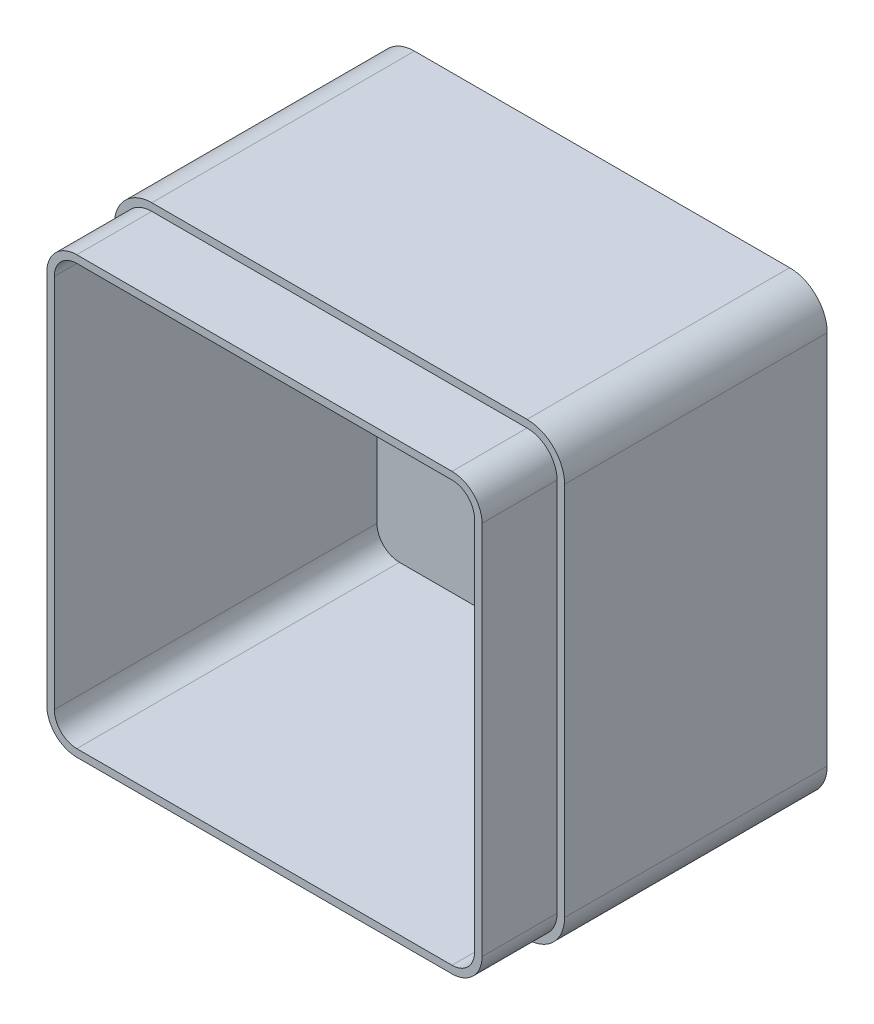
ISO-10303-21;
HEADER;
FILE_DESCRIPTION(('STEP AP214'),'2;1');
FILE_NAME('part.step','',(''),(''),'','','');
FILE_SCHEMA(('AUTOMOTIVE_DESIGN { 1 0 10303 214 1 1 1 1 }'));
ENDSEC;
DATA;
#1=APPLICATION_CONTEXT('core data for automotive mechanical design processes');
#2=APPLICATION_PROTOCOL_DEFINITION('international standard','automotive_design',2000,#1);
#3=PRODUCT_CONTEXT('',#1,'mechanical');
#4=PRODUCT('Part','Part','',(#3));
#5=PRODUCT_RELATED_PRODUCT_CATEGORY('part','',(#4));
#6=PRODUCT_DEFINITION_FORMATION('','',#4);
#7=PRODUCT_DEFINITION_CONTEXT('part definition',#1,'design');
#8=PRODUCT_DEFINITION('design','',#6,#7);
#9=PRODUCT_DEFINITION_SHAPE('','',#8);
#10=(LENGTH_UNIT() NAMED_UNIT(*) SI_UNIT(.MILLI.,.METRE.));
#11=(NAMED_UNIT(*) PLANE_ANGLE_UNIT() SI_UNIT($,.RADIAN.));
#12=(NAMED_UNIT(*) SI_UNIT($,.STERADIAN.) SOLID_ANGLE_UNIT());
#13=UNCERTAINTY_MEASURE_WITH_UNIT(LENGTH_MEASURE(1.E-05),#10,'distance_accuracy_value','');
#14=(GEOMETRIC_REPRESENTATION_CONTEXT(3) GLOBAL_UNCERTAINTY_ASSIGNED_CONTEXT((#13)) GLOBAL_UNIT_ASSIGNED_CONTEXT((#10,
#11,#12)) REPRESENTATION_CONTEXT('',''));
#15=CARTESIAN_POINT('',(0.,0.,0.));
#16=DIRECTION('',(0.,0.,1.));
#17=DIRECTION('',(1.,0.,0.));
#18=AXIS2_PLACEMENT_3D('',#15,#16,#17);
#19=CARTESIAN_POINT('',(0.,0.,90.));
#20=DIRECTION('',(0.,0.,-1.));
#21=DIRECTION('',(-1.,0.,0.));
#22=AXIS2_PLACEMENT_3D('',#19,#20,#21);
#23=PLANE('',#22);
#24=DIRECTION('',(1.,0.,0.));
#25=VECTOR('',#24,1.);
#26=CARTESIAN_POINT('',(0.,4.,90.));
#27=LINE('',#26,#25);
#28=CARTESIAN_POINT('',(9.99999999999999,4.,90.));
#29=VERTEX_POINT('',#28);
#30=CARTESIAN_POINT('',(110.,4.,90.));
#31=VERTEX_POINT('',#30);
#32=EDGE_CURVE('E384',#29,#31,#27,.T.);
#33=ORIENTED_EDGE('',*,*,#32,.F.);
#34=CARTESIAN_POINT('',(10.,10.,90.));
#35=DIRECTION('',(0.,0.,-1.));
#36=DIRECTION('',(-1.,0.,0.));
#37=AXIS2_PLACEMENT_3D('',#34,#35,#36);
#38=CIRCLE('',#37,6.);
#39=CARTESIAN_POINT('',(4.,9.99999999999999,90.));
#40=VERTEX_POINT('',#39);
#41=EDGE_CURVE('E385',#40,#29,#38,.F.);
#42=ORIENTED_EDGE('',*,*,#41,.F.);
#43=DIRECTION('',(0.,-1.,0.));
#44=VECTOR('',#43,1.);
#45=CARTESIAN_POINT('',(4.,0.,90.));
#46=LINE('',#45,#44);
#47=CARTESIAN_POINT('',(4.,110.,90.));
#48=VERTEX_POINT('',#47);
#49=EDGE_CURVE('E357',#48,#40,#46,.T.);
#50=ORIENTED_EDGE('',*,*,#49,.F.);
#51=CARTESIAN_POINT('',(10.,110.,90.));
#52=DIRECTION('',(0.,0.,-1.));
#53=DIRECTION('',(-1.,0.,0.));
#54=AXIS2_PLACEMENT_3D('',#51,#52,#53);
#55=CIRCLE('',#54,6.);
#56=CARTESIAN_POINT('',(9.99999999999999,116.,90.));
#57=VERTEX_POINT('',#56);
#58=EDGE_CURVE('E388',#57,#48,#55,.F.);
#59=ORIENTED_EDGE('',*,*,#58,.F.);
#60=DIRECTION('',(-1.,0.,0.));
#61=VECTOR('',#60,1.);
#62=CARTESIAN_POINT('',(0.,116.,90.));
#63=LINE('',#62,#61);
#64=CARTESIAN_POINT('',(110.,116.,90.));
#65=VERTEX_POINT('',#64);
#66=EDGE_CURVE('E374',#65,#57,#63,.T.);
#67=ORIENTED_EDGE('',*,*,#66,.F.);
#68=CARTESIAN_POINT('',(110.,110.,90.));
#69=DIRECTION('',(0.,0.,-1.));
#70=DIRECTION('',(-1.,0.,0.));
#71=AXIS2_PLACEMENT_3D('',#68,#69,#70);
#72=CIRCLE('',#71,6.);
#73=CARTESIAN_POINT('',(116.,110.,90.));
#74=VERTEX_POINT('',#73);
#75=EDGE_CURVE('E364',#74,#65,#72,.F.);
#76=ORIENTED_EDGE('',*,*,#75,.F.);
#77=DIRECTION('',(0.,1.,0.));
#78=VECTOR('',#77,1.);
#79=CARTESIAN_POINT('',(116.,0.,90.));
#80=LINE('',#79,#78);
#81=CARTESIAN_POINT('',(116.,9.99999999999999,90.));
#82=VERTEX_POINT('',#81);
#83=EDGE_CURVE('E392',#82,#74,#80,.T.);
#84=ORIENTED_EDGE('',*,*,#83,.F.);
#85=CARTESIAN_POINT('',(110.,10.,90.));
#86=DIRECTION('',(0.,0.,-1.));
#87=DIRECTION('',(-1.,0.,0.));
#88=AXIS2_PLACEMENT_3D('',#85,#86,#87);
#89=CIRCLE('',#88,6.);
#90=EDGE_CURVE('E334',#31,#82,#89,.F.);
#91=ORIENTED_EDGE('',*,*,#90,.F.);
#92=EDGE_LOOP('',(#33,#42,#50,#59,#67,#76,#84,#91));
#93=FACE_BOUND('',#92,.T.);
#94=CARTESIAN_POINT('',(10.,10.,90.));
#95=DIRECTION('',(0.,0.,1.));
#96=DIRECTION('',(1.,0.,0.));
#97=AXIS2_PLACEMENT_3D('',#94,#95,#96);
#98=CIRCLE('',#97,8.);
#99=CARTESIAN_POINT('',(2.,9.99999999999999,90.));
#100=VERTEX_POINT('',#99);
#101=CARTESIAN_POINT('',(10.,2.,90.));
#102=VERTEX_POINT('',#101);
#103=EDGE_CURVE('E256',#100,#102,#98,.T.);
#104=ORIENTED_EDGE('',*,*,#103,.T.);
#105=DIRECTION('',(1.,0.,0.));
#106=VECTOR('',#105,1.);
#107=CARTESIAN_POINT('',(10.,2.,90.));
#108=LINE('',#107,#106);
#109=CARTESIAN_POINT('',(110.,2.,90.));
#110=VERTEX_POINT('',#109);
#111=EDGE_CURVE('E206',#102,#110,#108,.T.);
#112=ORIENTED_EDGE('',*,*,#111,.T.);
#113=CARTESIAN_POINT('',(110.,10.,90.));
#114=DIRECTION('',(0.,0.,1.));
#115=DIRECTION('',(1.,0.,0.));
#116=AXIS2_PLACEMENT_3D('',#113,#114,#115);
#117=CIRCLE('',#116,7.99999999999999);
#118=CARTESIAN_POINT('',(118.,10.,90.));
#119=VERTEX_POINT('',#118);
#120=EDGE_CURVE('E54',#110,#119,#117,.T.);
#121=ORIENTED_EDGE('',*,*,#120,.T.);
#122=DIRECTION('',(0.,1.,0.));
#123=VECTOR('',#122,1.);
#124=CARTESIAN_POINT('',(118.,10.,90.));
#125=LINE('',#124,#123);
#126=CARTESIAN_POINT('',(118.,110.,90.));
#127=VERTEX_POINT('',#126);
#128=EDGE_CURVE('E263',#119,#127,#125,.T.);
#129=ORIENTED_EDGE('',*,*,#128,.T.);
#130=CARTESIAN_POINT('',(110.,110.,90.));
#131=DIRECTION('',(0.,0.,1.));
#132=DIRECTION('',(1.,0.,0.));
#133=AXIS2_PLACEMENT_3D('',#130,#131,#132);
#134=CIRCLE('',#133,7.99999999999999);
#135=CARTESIAN_POINT('',(110.,118.,90.));
#136=VERTEX_POINT('',#135);
#137=EDGE_CURVE('E267',#127,#136,#134,.T.);
#138=ORIENTED_EDGE('',*,*,#137,.T.);
#139=DIRECTION('',(-1.,0.,0.));
#140=VECTOR('',#139,1.);
#141=CARTESIAN_POINT('',(110.,118.,90.));
#142=LINE('',#141,#140);
#143=CARTESIAN_POINT('',(9.99999999999999,118.,90.));
#144=VERTEX_POINT('',#143);
#145=EDGE_CURVE('E271',#136,#144,#142,.T.);
#146=ORIENTED_EDGE('',*,*,#145,.T.);
#147=CARTESIAN_POINT('',(10.,110.,90.));
#148=DIRECTION('',(0.,0.,1.));
#149=DIRECTION('',(1.,0.,0.));
#150=AXIS2_PLACEMENT_3D('',#147,#148,#149);
#151=CIRCLE('',#150,7.99999999999999);
#152=CARTESIAN_POINT('',(2.,110.,90.));
#153=VERTEX_POINT('',#152);
#154=EDGE_CURVE('E233',#144,#153,#151,.T.);
#155=ORIENTED_EDGE('',*,*,#154,.T.);
#156=DIRECTION('',(0.,-1.,0.));
#157=VECTOR('',#156,1.);
#158=CARTESIAN_POINT('',(2.,110.,90.));
#159=LINE('',#158,#157);
#160=EDGE_CURVE('E229',#153,#100,#159,.T.);
#161=ORIENTED_EDGE('',*,*,#160,.T.);
#162=EDGE_LOOP('',(#104,#112,#121,#129,#138,#146,#155,#161));
#163=FACE_BOUND('',#162,.T.);
#164=ADVANCED_FACE('F38',(#93,#163),#23,.F.);
#165=CARTESIAN_POINT('',(4.,0.,90.));
#166=DIRECTION('',(1.,0.,0.));
#167=DIRECTION('',(0.,0.,-1.));
#168=AXIS2_PLACEMENT_3D('',#165,#166,#167);
#169=PLANE('',#168);
#170=DIRECTION('',(0.,-1.,0.));
#171=VECTOR('',#170,1.);
#172=CARTESIAN_POINT('',(4.,0.,4.));
#173=LINE('',#172,#171);
#174=CARTESIAN_POINT('',(4.,110.,4.));
#175=VERTEX_POINT('',#174);
#176=CARTESIAN_POINT('',(4.,9.99999999999999,4.));
#177=VERTEX_POINT('',#176);
#178=EDGE_CURVE('E320',#175,#177,#173,.T.);
#179=ORIENTED_EDGE('',*,*,#178,.F.);
#180=DIRECTION('',(0.,0.,-1.));
#181=VECTOR('',#180,1.);
#182=CARTESIAN_POINT('',(4.,110.,90.));
#183=LINE('',#182,#181);
#184=EDGE_CURVE('E330',#48,#175,#183,.T.);
#185=ORIENTED_EDGE('',*,*,#184,.F.);
#186=ORIENTED_EDGE('',*,*,#49,.T.);
#187=DIRECTION('',(0.,0.,-1.));
#188=VECTOR('',#187,1.);
#189=CARTESIAN_POINT('',(4.,9.99999999999999,90.));
#190=LINE('',#189,#188);
#191=EDGE_CURVE('E325',#177,#40,#190,.F.);
#192=ORIENTED_EDGE('',*,*,#191,.F.);
#193=EDGE_LOOP('',(#179,#185,#186,#192));
#194=FACE_BOUND('',#193,.T.);
#195=ADVANCED_FACE('F503',(#194),#169,.T.);
#196=CARTESIAN_POINT('',(0.,4.,90.));
#197=DIRECTION('',(0.,1.,0.));
#198=DIRECTION('',(0.,0.,1.));
#199=AXIS2_PLACEMENT_3D('',#196,#197,#198);
#200=PLANE('',#199);
#201=DIRECTION('',(1.,0.,0.));
#202=VECTOR('',#201,1.);
#203=CARTESIAN_POINT('',(0.,4.,4.));
#204=LINE('',#203,#202);
#205=CARTESIAN_POINT('',(9.99999999999999,4.,4.));
#206=VERTEX_POINT('',#205);
#207=CARTESIAN_POINT('',(110.,4.,4.));
#208=VERTEX_POINT('',#207);
#209=EDGE_CURVE('E324',#206,#208,#204,.T.);
#210=ORIENTED_EDGE('',*,*,#209,.F.);
#211=DIRECTION('',(0.,0.,1.));
#212=VECTOR('',#211,1.);
#213=CARTESIAN_POINT('',(9.99999999999999,4.,90.));
#214=LINE('',#213,#212);
#215=EDGE_CURVE('E343',#29,#206,#214,.F.);
#216=ORIENTED_EDGE('',*,*,#215,.F.);
#217=ORIENTED_EDGE('',*,*,#32,.T.);
#218=DIRECTION('',(0.,0.,1.));
#219=VECTOR('',#218,1.);
#220=CARTESIAN_POINT('',(110.,4.,90.));
#221=LINE('',#220,#219);
#222=EDGE_CURVE('E361',#208,#31,#221,.T.);
#223=ORIENTED_EDGE('',*,*,#222,.F.);
#224=EDGE_LOOP('',(#210,#216,#217,#223));
#225=FACE_BOUND('',#224,.T.);
#226=ADVANCED_FACE('F511',(#225),#200,.T.);
#227=CARTESIAN_POINT('',(116.,0.,90.));
#228=DIRECTION('',(-1.,0.,0.));
#229=DIRECTION('',(0.,0.,1.));
#230=AXIS2_PLACEMENT_3D('',#227,#228,#229);
#231=PLANE('',#230);
#232=ORIENTED_EDGE('',*,*,#83,.T.);
#233=DIRECTION('',(0.,0.,1.));
#234=VECTOR('',#233,1.);
#235=CARTESIAN_POINT('',(116.,110.,90.));
#236=LINE('',#235,#234);
#237=CARTESIAN_POINT('',(116.,110.,4.));
#238=VERTEX_POINT('',#237);
#239=EDGE_CURVE('E371',#238,#74,#236,.T.);
#240=ORIENTED_EDGE('',*,*,#239,.F.);
#241=DIRECTION('',(0.,1.,0.));
#242=VECTOR('',#241,1.);
#243=CARTESIAN_POINT('',(116.,0.,4.));
#244=LINE('',#243,#242);
#245=CARTESIAN_POINT('',(116.,9.99999999999999,4.));
#246=VERTEX_POINT('',#245);
#247=EDGE_CURVE('E335',#246,#238,#244,.T.);
#248=ORIENTED_EDGE('',*,*,#247,.F.);
#249=DIRECTION('',(0.,0.,1.));
#250=VECTOR('',#249,1.);
#251=CARTESIAN_POINT('',(116.,9.99999999999999,90.));
#252=LINE('',#251,#250);
#253=EDGE_CURVE('E360',#82,#246,#252,.F.);
#254=ORIENTED_EDGE('',*,*,#253,.F.);
#255=EDGE_LOOP('',(#232,#240,#248,#254));
#256=FACE_BOUND('',#255,.T.);
#257=ADVANCED_FACE('F631',(#256),#231,.T.);
#258=CARTESIAN_POINT('',(0.,116.,90.));
#259=DIRECTION('',(0.,-1.,0.));
#260=DIRECTION('',(0.,0.,-1.));
#261=AXIS2_PLACEMENT_3D('',#258,#259,#260);
#262=PLANE('',#261);
#263=DIRECTION('',(-1.,0.,0.));
#264=VECTOR('',#263,1.);
#265=CARTESIAN_POINT('',(0.,116.,4.));
#266=LINE('',#265,#264);
#267=CARTESIAN_POINT('',(110.,116.,4.));
#268=VERTEX_POINT('',#267);
#269=CARTESIAN_POINT('',(9.99999999999999,116.,4.));
#270=VERTEX_POINT('',#269);
#271=EDGE_CURVE('E339',#268,#270,#266,.T.);
#272=ORIENTED_EDGE('',*,*,#271,.F.);
#273=DIRECTION('',(0.,0.,-1.));
#274=VECTOR('',#273,1.);
#275=CARTESIAN_POINT('',(110.,116.,90.));
#276=LINE('',#275,#274);
#277=EDGE_CURVE('E329',#65,#268,#276,.T.);
#278=ORIENTED_EDGE('',*,*,#277,.F.);
#279=ORIENTED_EDGE('',*,*,#66,.T.);
#280=DIRECTION('',(0.,0.,-1.));
#281=VECTOR('',#280,1.);
#282=CARTESIAN_POINT('',(9.99999999999999,116.,90.));
#283=LINE('',#282,#281);
#284=EDGE_CURVE('E378',#270,#57,#283,.F.);
#285=ORIENTED_EDGE('',*,*,#284,.F.);
#286=EDGE_LOOP('',(#272,#278,#279,#285));
#287=FACE_BOUND('',#286,.T.);
#288=ADVANCED_FACE('F635',(#287),#262,.T.);
#289=CARTESIAN_POINT('',(0.,0.,4.));
#290=DIRECTION('',(0.,0.,-1.));
#291=DIRECTION('',(-1.,0.,0.));
#292=AXIS2_PLACEMENT_3D('',#289,#290,#291);
#293=PLANE('',#292);
#294=ORIENTED_EDGE('',*,*,#247,.T.);
#295=CARTESIAN_POINT('',(110.,110.,4.));
#296=DIRECTION('',(0.,0.,-1.));
#297=DIRECTION('',(-1.,0.,0.));
#298=AXIS2_PLACEMENT_3D('',#295,#296,#297);
#299=CIRCLE('',#298,6.);
#300=EDGE_CURVE('E353',#268,#238,#299,.T.);
#301=ORIENTED_EDGE('',*,*,#300,.F.);
#302=ORIENTED_EDGE('',*,*,#271,.T.);
#303=CARTESIAN_POINT('',(10.,110.,4.));
#304=DIRECTION('',(0.,0.,-1.));
#305=DIRECTION('',(-1.,0.,0.));
#306=AXIS2_PLACEMENT_3D('',#303,#304,#305);
#307=CIRCLE('',#306,6.);
#308=EDGE_CURVE('E350',#175,#270,#307,.T.);
#309=ORIENTED_EDGE('',*,*,#308,.F.);
#310=ORIENTED_EDGE('',*,*,#178,.T.);
#311=CARTESIAN_POINT('',(10.,10.,4.));
#312=DIRECTION('',(0.,0.,-1.));
#313=DIRECTION('',(-1.,0.,0.));
#314=AXIS2_PLACEMENT_3D('',#311,#312,#313);
#315=CIRCLE('',#314,6.);
#316=EDGE_CURVE('E344',#206,#177,#315,.T.);
#317=ORIENTED_EDGE('',*,*,#316,.F.);
#318=ORIENTED_EDGE('',*,*,#209,.T.);
#319=CARTESIAN_POINT('',(110.,10.,4.));
#320=DIRECTION('',(0.,0.,-1.));
#321=DIRECTION('',(-1.,0.,0.));
#322=AXIS2_PLACEMENT_3D('',#319,#320,#321);
#323=CIRCLE('',#322,6.);
#324=EDGE_CURVE('E340',#246,#208,#323,.T.);
#325=ORIENTED_EDGE('',*,*,#324,.F.);
#326=EDGE_LOOP('',(#294,#301,#302,#309,#310,#317,#318,#325));
#327=FACE_BOUND('',#326,.T.);
#328=ADVANCED_FACE('F639',(#327),#293,.F.);
#329=CARTESIAN_POINT('',(110.,10.,90.));
#330=DIRECTION('',(0.,0.,-1.));
#331=DIRECTION('',(-1.,0.,0.));
#332=AXIS2_PLACEMENT_3D('',#329,#330,#331);
#333=CYLINDRICAL_SURFACE('',#332,6.);
#334=ORIENTED_EDGE('',*,*,#90,.T.);
#335=ORIENTED_EDGE('',*,*,#253,.T.);
#336=ORIENTED_EDGE('',*,*,#324,.T.);
#337=ORIENTED_EDGE('',*,*,#222,.T.);
#338=EDGE_LOOP('',(#334,#335,#336,#337));
#339=FACE_BOUND('',#338,.T.);
#340=ADVANCED_FACE('F643',(#339),#333,.F.);
#341=CARTESIAN_POINT('',(10.,10.,90.));
#342=DIRECTION('',(0.,0.,-1.));
#343=DIRECTION('',(-1.,0.,0.));
#344=AXIS2_PLACEMENT_3D('',#341,#342,#343);
#345=CYLINDRICAL_SURFACE('',#344,6.);
#346=ORIENTED_EDGE('',*,*,#41,.T.);
#347=ORIENTED_EDGE('',*,*,#215,.T.);
#348=ORIENTED_EDGE('',*,*,#316,.T.);
#349=ORIENTED_EDGE('',*,*,#191,.T.);
#350=EDGE_LOOP('',(#346,#347,#348,#349));
#351=FACE_BOUND('',#350,.T.);
#352=ADVANCED_FACE('F647',(#351),#345,.F.);
#353=CARTESIAN_POINT('',(10.,110.,90.));
#354=DIRECTION('',(0.,0.,-1.));
#355=DIRECTION('',(-1.,0.,0.));
#356=AXIS2_PLACEMENT_3D('',#353,#354,#355);
#357=CYLINDRICAL_SURFACE('',#356,6.);
#358=ORIENTED_EDGE('',*,*,#58,.T.);
#359=ORIENTED_EDGE('',*,*,#184,.T.);
#360=ORIENTED_EDGE('',*,*,#308,.T.);
#361=ORIENTED_EDGE('',*,*,#284,.T.);
#362=EDGE_LOOP('',(#358,#359,#360,#361));
#363=FACE_BOUND('',#362,.T.);
#364=ADVANCED_FACE('F650',(#363),#357,.F.);
#365=CARTESIAN_POINT('',(110.,110.,90.));
#366=DIRECTION('',(0.,0.,-1.));
#367=DIRECTION('',(-1.,0.,0.));
#368=AXIS2_PLACEMENT_3D('',#365,#366,#367);
#369=CYLINDRICAL_SURFACE('',#368,6.);
#370=ORIENTED_EDGE('',*,*,#75,.T.);
#371=ORIENTED_EDGE('',*,*,#277,.T.);
#372=ORIENTED_EDGE('',*,*,#300,.T.);
#373=ORIENTED_EDGE('',*,*,#239,.T.);
#374=EDGE_LOOP('',(#370,#371,#372,#373));
#375=FACE_BOUND('',#374,.T.);
#376=ADVANCED_FACE('F518',(#375),#369,.F.);
#377=CARTESIAN_POINT('',(10.,10.,70.));
#378=DIRECTION('',(0.,0.,1.));
#379=DIRECTION('',(1.,0.,0.));
#380=AXIS2_PLACEMENT_3D('',#377,#378,#379);
#381=PLANE('',#380);
#382=DIRECTION('',(0.,-1.,0.));
#383=VECTOR('',#382,1.);
#384=CARTESIAN_POINT('',(2.,110.,70.));
#385=LINE('',#384,#383);
#386=CARTESIAN_POINT('',(2.,110.,70.));
#387=VERTEX_POINT('',#386);
#388=CARTESIAN_POINT('',(2.,9.99999999999999,70.));
#389=VERTEX_POINT('',#388);
#390=EDGE_CURVE('E213',#387,#389,#385,.T.);
#391=ORIENTED_EDGE('',*,*,#390,.F.);
#392=CARTESIAN_POINT('',(10.,110.,70.));
#393=DIRECTION('',(0.,0.,1.));
#394=DIRECTION('',(1.,0.,0.));
#395=AXIS2_PLACEMENT_3D('',#392,#393,#394);
#396=CIRCLE('',#395,7.99999999999999);
#397=CARTESIAN_POINT('',(9.99999999999999,118.,70.));
#398=VERTEX_POINT('',#397);
#399=EDGE_CURVE('E250',#398,#387,#396,.T.);
#400=ORIENTED_EDGE('',*,*,#399,.F.);
#401=DIRECTION('',(-1.,0.,0.));
#402=VECTOR('',#401,1.);
#403=CARTESIAN_POINT('',(110.,118.,70.));
#404=LINE('',#403,#402);
#405=CARTESIAN_POINT('',(110.,118.,70.));
#406=VERTEX_POINT('',#405);
#407=EDGE_CURVE('E246',#406,#398,#404,.T.);
#408=ORIENTED_EDGE('',*,*,#407,.F.);
#409=CARTESIAN_POINT('',(110.,110.,70.));
#410=DIRECTION('',(0.,0.,1.));
#411=DIRECTION('',(1.,0.,0.));
#412=AXIS2_PLACEMENT_3D('',#409,#410,#411);
#413=CIRCLE('',#412,7.99999999999999);
#414=CARTESIAN_POINT('',(118.,110.,70.));
#415=VERTEX_POINT('',#414);
#416=EDGE_CURVE('E242',#415,#406,#413,.T.);
#417=ORIENTED_EDGE('',*,*,#416,.F.);
#418=DIRECTION('',(0.,1.,0.));
#419=VECTOR('',#418,1.);
#420=CARTESIAN_POINT('',(118.,10.,70.));
#421=LINE('',#420,#419);
#422=CARTESIAN_POINT('',(118.,10.,70.));
#423=VERTEX_POINT('',#422);
#424=EDGE_CURVE('E238',#423,#415,#421,.T.);
#425=ORIENTED_EDGE('',*,*,#424,.F.);
#426=CARTESIAN_POINT('',(110.,10.,70.));
#427=DIRECTION('',(0.,0.,1.));
#428=DIRECTION('',(1.,0.,0.));
#429=AXIS2_PLACEMENT_3D('',#426,#427,#428);
#430=CIRCLE('',#429,7.99999999999999);
#431=CARTESIAN_POINT('',(110.,2.,70.));
#432=VERTEX_POINT('',#431);
#433=EDGE_CURVE('E223',#432,#423,#430,.T.);
#434=ORIENTED_EDGE('',*,*,#433,.F.);
#435=DIRECTION('',(1.,0.,0.));
#436=VECTOR('',#435,1.);
#437=CARTESIAN_POINT('',(10.,2.,70.));
#438=LINE('',#437,#436);
#439=CARTESIAN_POINT('',(10.,2.,70.));
#440=VERTEX_POINT('',#439);
#441=EDGE_CURVE('E204',#440,#432,#438,.T.);
#442=ORIENTED_EDGE('',*,*,#441,.F.);
#443=CARTESIAN_POINT('',(10.,10.,70.));
#444=DIRECTION('',(0.,0.,1.));
#445=DIRECTION('',(1.,0.,0.));
#446=AXIS2_PLACEMENT_3D('',#443,#444,#445);
#447=CIRCLE('',#446,8.);
#448=EDGE_CURVE('E219',#389,#440,#447,.T.);
#449=ORIENTED_EDGE('',*,*,#448,.F.);
#450=EDGE_LOOP('',(#391,#400,#408,#417,#425,#434,#442,#449));
#451=FACE_BOUND('',#450,.T.);
#452=CARTESIAN_POINT('',(10.,10.,70.));
#453=DIRECTION('',(0.,0.,1.));
#454=DIRECTION('',(1.,0.,0.));
#455=AXIS2_PLACEMENT_3D('',#452,#453,#454);
#456=CIRCLE('',#455,10.);
#457=CARTESIAN_POINT('',(0.,9.99999999999999,70.));
#458=VERTEX_POINT('',#457);
#459=CARTESIAN_POINT('',(10.,0.,70.));
#460=VERTEX_POINT('',#459);
#461=EDGE_CURVE('E280',#458,#460,#456,.T.);
#462=ORIENTED_EDGE('',*,*,#461,.T.);
#463=DIRECTION('',(1.,0.,0.));
#464=VECTOR('',#463,1.);
#465=CARTESIAN_POINT('',(10.,0.,70.));
#466=LINE('',#465,#464);
#467=CARTESIAN_POINT('',(110.,0.,70.));
#468=VERTEX_POINT('',#467);
#469=EDGE_CURVE('E300',#460,#468,#466,.T.);
#470=ORIENTED_EDGE('',*,*,#469,.T.);
#471=CARTESIAN_POINT('',(110.,10.,70.));
#472=DIRECTION('',(0.,0.,1.));
#473=DIRECTION('',(1.,0.,0.));
#474=AXIS2_PLACEMENT_3D('',#471,#472,#473);
#475=CIRCLE('',#474,9.99999999999999);
#476=CARTESIAN_POINT('',(120.,10.,70.));
#477=VERTEX_POINT('',#476);
#478=EDGE_CURVE('E303',#468,#477,#475,.T.);
#479=ORIENTED_EDGE('',*,*,#478,.T.);
#480=DIRECTION('',(0.,1.,0.));
#481=VECTOR('',#480,1.);
#482=CARTESIAN_POINT('',(120.,10.,70.));
#483=LINE('',#482,#481);
#484=CARTESIAN_POINT('',(120.,110.,70.));
#485=VERTEX_POINT('',#484);
#486=EDGE_CURVE('E62',#477,#485,#483,.T.);
#487=ORIENTED_EDGE('',*,*,#486,.T.);
#488=CARTESIAN_POINT('',(110.,110.,70.));
#489=DIRECTION('',(0.,0.,1.));
#490=DIRECTION('',(1.,0.,0.));
#491=AXIS2_PLACEMENT_3D('',#488,#489,#490);
#492=CIRCLE('',#491,9.99999999999999);
#493=CARTESIAN_POINT('',(110.,120.,70.));
#494=VERTEX_POINT('',#493);
#495=EDGE_CURVE('E308',#485,#494,#492,.T.);
#496=ORIENTED_EDGE('',*,*,#495,.T.);
#497=DIRECTION('',(-1.,0.,0.));
#498=VECTOR('',#497,1.);
#499=CARTESIAN_POINT('',(110.,120.,70.));
#500=LINE('',#499,#498);
#501=CARTESIAN_POINT('',(10.,120.,70.));
#502=VERTEX_POINT('',#501);
#503=EDGE_CURVE('E311',#494,#502,#500,.T.);
#504=ORIENTED_EDGE('',*,*,#503,.T.);
#505=CARTESIAN_POINT('',(10.,110.,70.));
#506=DIRECTION('',(0.,0.,1.));
#507=DIRECTION('',(1.,0.,0.));
#508=AXIS2_PLACEMENT_3D('',#505,#506,#507);
#509=CIRCLE('',#508,9.99999999999999);
#510=CARTESIAN_POINT('',(0.,110.,70.));
#511=VERTEX_POINT('',#510);
#512=EDGE_CURVE('E314',#502,#511,#509,.T.);
#513=ORIENTED_EDGE('',*,*,#512,.T.);
#514=DIRECTION('',(0.,-1.,0.));
#515=VECTOR('',#514,1.);
#516=CARTESIAN_POINT('',(0.,110.,70.));
#517=LINE('',#516,#515);
#518=EDGE_CURVE('E317',#511,#458,#517,.T.);
#519=ORIENTED_EDGE('',*,*,#518,.T.);
#520=EDGE_LOOP('',(#462,#470,#479,#487,#496,#504,#513,#519));
#521=FACE_BOUND('',#520,.T.);
#522=ADVANCED_FACE('F218',(#451,#521),#381,.T.);
#523=CARTESIAN_POINT('',(10.,10.,70.));
#524=DIRECTION('',(0.,0.,1.));
#525=DIRECTION('',(1.,0.,0.));
#526=AXIS2_PLACEMENT_3D('',#523,#524,#525);
#527=CYLINDRICAL_SURFACE('',#526,8.);
#528=ORIENTED_EDGE('',*,*,#103,.F.);
#529=DIRECTION('',(0.,0.,1.));
#530=VECTOR('',#529,1.);
#531=CARTESIAN_POINT('',(2.,9.99999999999999,70.));
#532=LINE('',#531,#530);
#533=EDGE_CURVE('E227',#389,#100,#532,.T.);
#534=ORIENTED_EDGE('',*,*,#533,.F.);
#535=ORIENTED_EDGE('',*,*,#448,.T.);
#536=DIRECTION('',(0.,0.,1.));
#537=VECTOR('',#536,1.);
#538=CARTESIAN_POINT('',(10.,2.,70.));
#539=LINE('',#538,#537);
#540=EDGE_CURVE('E201',#440,#102,#539,.T.);
#541=ORIENTED_EDGE('',*,*,#540,.T.);
#542=EDGE_LOOP('',(#528,#534,#535,#541));
#543=FACE_BOUND('',#542,.T.);
#544=ADVANCED_FACE('F226',(#543),#527,.T.);
#545=CARTESIAN_POINT('',(2.,110.,70.));
#546=DIRECTION('',(-1.,0.,0.));
#547=DIRECTION('',(0.,-1.,0.));
#548=AXIS2_PLACEMENT_3D('',#545,#546,#547);
#549=PLANE('',#548);
#550=ORIENTED_EDGE('',*,*,#160,.F.);
#551=DIRECTION('',(0.,0.,1.));
#552=VECTOR('',#551,1.);
#553=CARTESIAN_POINT('',(2.,110.,70.));
#554=LINE('',#553,#552);
#555=EDGE_CURVE('E281',#387,#153,#554,.T.);
#556=ORIENTED_EDGE('',*,*,#555,.F.);
#557=ORIENTED_EDGE('',*,*,#390,.T.);
#558=ORIENTED_EDGE('',*,*,#533,.T.);
#559=EDGE_LOOP('',(#550,#556,#557,#558));
#560=FACE_BOUND('',#559,.T.);
#561=ADVANCED_FACE('F559',(#560),#549,.T.);
#562=CARTESIAN_POINT('',(10.,110.,70.));
#563=DIRECTION('',(0.,0.,1.));
#564=DIRECTION('',(1.,0.,0.));
#565=AXIS2_PLACEMENT_3D('',#562,#563,#564);
#566=CYLINDRICAL_SURFACE('',#565,7.99999999999999);
#567=ORIENTED_EDGE('',*,*,#154,.F.);
#568=DIRECTION('',(0.,0.,1.));
#569=VECTOR('',#568,1.);
#570=CARTESIAN_POINT('',(9.99999999999999,118.,70.));
#571=LINE('',#570,#569);
#572=EDGE_CURVE('E284',#398,#144,#571,.T.);
#573=ORIENTED_EDGE('',*,*,#572,.F.);
#574=ORIENTED_EDGE('',*,*,#399,.T.);
#575=ORIENTED_EDGE('',*,*,#555,.T.);
#576=EDGE_LOOP('',(#567,#573,#574,#575));
#577=FACE_BOUND('',#576,.T.);
#578=ADVANCED_FACE('F567',(#577),#566,.T.);
#579=CARTESIAN_POINT('',(110.,118.,70.));
#580=DIRECTION('',(0.,1.,0.));
#581=DIRECTION('',(0.,0.,1.));
#582=AXIS2_PLACEMENT_3D('',#579,#580,#581);
#583=PLANE('',#582);
#584=ORIENTED_EDGE('',*,*,#145,.F.);
#585=DIRECTION('',(0.,0.,1.));
#586=VECTOR('',#585,1.);
#587=CARTESIAN_POINT('',(110.,118.,70.));
#588=LINE('',#587,#586);
#589=EDGE_CURVE('E287',#406,#136,#588,.T.);
#590=ORIENTED_EDGE('',*,*,#589,.F.);
#591=ORIENTED_EDGE('',*,*,#407,.T.);
#592=ORIENTED_EDGE('',*,*,#572,.T.);
#593=EDGE_LOOP('',(#584,#590,#591,#592));
#594=FACE_BOUND('',#593,.T.);
#595=ADVANCED_FACE('F576',(#594),#583,.T.);
#596=CARTESIAN_POINT('',(110.,110.,70.));
#597=DIRECTION('',(0.,0.,1.));
#598=DIRECTION('',(1.,0.,0.));
#599=AXIS2_PLACEMENT_3D('',#596,#597,#598);
#600=CYLINDRICAL_SURFACE('',#599,7.99999999999999);
#601=ORIENTED_EDGE('',*,*,#137,.F.);
#602=DIRECTION('',(0.,0.,1.));
#603=VECTOR('',#602,1.);
#604=CARTESIAN_POINT('',(118.,110.,70.));
#605=LINE('',#604,#603);
#606=EDGE_CURVE('E290',#415,#127,#605,.T.);
#607=ORIENTED_EDGE('',*,*,#606,.F.);
#608=ORIENTED_EDGE('',*,*,#416,.T.);
#609=ORIENTED_EDGE('',*,*,#589,.T.);
#610=EDGE_LOOP('',(#601,#607,#608,#609));
#611=FACE_BOUND('',#610,.T.);
#612=ADVANCED_FACE('F585',(#611),#600,.T.);
#613=CARTESIAN_POINT('',(118.,10.,70.));
#614=DIRECTION('',(1.,0.,0.));
#615=DIRECTION('',(0.,0.,-1.));
#616=AXIS2_PLACEMENT_3D('',#613,#614,#615);
#617=PLANE('',#616);
#618=ORIENTED_EDGE('',*,*,#128,.F.);
#619=DIRECTION('',(0.,0.,1.));
#620=VECTOR('',#619,1.);
#621=CARTESIAN_POINT('',(118.,10.,70.));
#622=LINE('',#621,#620);
#623=EDGE_CURVE('E293',#423,#119,#622,.T.);
#624=ORIENTED_EDGE('',*,*,#623,.F.);
#625=ORIENTED_EDGE('',*,*,#424,.T.);
#626=ORIENTED_EDGE('',*,*,#606,.T.);
#627=EDGE_LOOP('',(#618,#624,#625,#626));
#628=FACE_BOUND('',#627,.T.);
#629=ADVANCED_FACE('F594',(#628),#617,.T.);
#630=CARTESIAN_POINT('',(110.,10.,70.));
#631=DIRECTION('',(0.,0.,1.));
#632=DIRECTION('',(1.,0.,0.));
#633=AXIS2_PLACEMENT_3D('',#630,#631,#632);
#634=CYLINDRICAL_SURFACE('',#633,7.99999999999999);
#635=ORIENTED_EDGE('',*,*,#120,.F.);
#636=DIRECTION('',(0.,0.,1.));
#637=VECTOR('',#636,1.);
#638=CARTESIAN_POINT('',(110.,2.,70.));
#639=LINE('',#638,#637);
#640=EDGE_CURVE('E212',#432,#110,#639,.T.);
#641=ORIENTED_EDGE('',*,*,#640,.F.);
#642=ORIENTED_EDGE('',*,*,#433,.T.);
#643=ORIENTED_EDGE('',*,*,#623,.T.);
#644=EDGE_LOOP('',(#635,#641,#642,#643));
#645=FACE_BOUND('',#644,.T.);
#646=ADVANCED_FACE('F603',(#645),#634,.T.);
#647=CARTESIAN_POINT('',(10.,2.,70.));
#648=DIRECTION('',(0.,-1.,0.));
#649=DIRECTION('',(0.,0.,-1.));
#650=AXIS2_PLACEMENT_3D('',#647,#648,#649);
#651=PLANE('',#650);
#652=ORIENTED_EDGE('',*,*,#111,.F.);
#653=ORIENTED_EDGE('',*,*,#540,.F.);
#654=ORIENTED_EDGE('',*,*,#441,.T.);
#655=ORIENTED_EDGE('',*,*,#640,.T.);
#656=EDGE_LOOP('',(#652,#653,#654,#655));
#657=FACE_BOUND('',#656,.T.);
#658=ADVANCED_FACE('F203',(#657),#651,.T.);
#659=CARTESIAN_POINT('',(0.,0.,0.));
#660=DIRECTION('',(0.,0.,-1.));
#661=DIRECTION('',(-1.,0.,0.));
#662=AXIS2_PLACEMENT_3D('',#659,#660,#661);
#663=PLANE('',#662);
#664=DIRECTION('',(0.,1.,0.));
#665=VECTOR('',#664,1.);
#666=CARTESIAN_POINT('',(120.,0.,0.));
#667=LINE('',#666,#665);
#668=CARTESIAN_POINT('',(120.,9.99999999999999,0.));
#669=VERTEX_POINT('',#668);
#670=CARTESIAN_POINT('',(120.,110.,0.));
#671=VERTEX_POINT('',#670);
#672=EDGE_CURVE('E412',#669,#671,#667,.T.);
#673=ORIENTED_EDGE('',*,*,#672,.F.);
#674=CARTESIAN_POINT('',(110.,10.,0.));
#675=DIRECTION('',(0.,0.,-1.));
#676=DIRECTION('',(-1.,0.,0.));
#677=AXIS2_PLACEMENT_3D('',#674,#675,#676);
#678=CIRCLE('',#677,10.);
#679=CARTESIAN_POINT('',(110.,0.,0.));
#680=VERTEX_POINT('',#679);
#681=EDGE_CURVE('E436',#669,#680,#678,.T.);
#682=ORIENTED_EDGE('',*,*,#681,.T.);
#683=DIRECTION('',(1.,0.,0.));
#684=VECTOR('',#683,1.);
#685=CARTESIAN_POINT('',(0.,0.,0.));
#686=LINE('',#685,#684);
#687=CARTESIAN_POINT('',(10.,0.,0.));
#688=VERTEX_POINT('',#687);
#689=EDGE_CURVE('E408',#688,#680,#686,.T.);
#690=ORIENTED_EDGE('',*,*,#689,.F.);
#691=CARTESIAN_POINT('',(10.,10.,0.));
#692=DIRECTION('',(0.,0.,-1.));
#693=DIRECTION('',(-1.,0.,0.));
#694=AXIS2_PLACEMENT_3D('',#691,#692,#693);
#695=CIRCLE('',#694,10.);
#696=CARTESIAN_POINT('',(0.,9.99999999999999,0.));
#697=VERTEX_POINT('',#696);
#698=EDGE_CURVE('E433',#688,#697,#695,.T.);
#699=ORIENTED_EDGE('',*,*,#698,.T.);
#700=DIRECTION('',(0.,-1.,0.));
#701=VECTOR('',#700,1.);
#702=CARTESIAN_POINT('',(0.,0.,0.));
#703=LINE('',#702,#701);
#704=CARTESIAN_POINT('',(0.,110.,0.));
#705=VERTEX_POINT('',#704);
#706=EDGE_CURVE('E381',#705,#697,#703,.T.);
#707=ORIENTED_EDGE('',*,*,#706,.F.);
#708=CARTESIAN_POINT('',(10.,110.,0.));
#709=DIRECTION('',(0.,0.,-1.));
#710=DIRECTION('',(-1.,0.,0.));
#711=AXIS2_PLACEMENT_3D('',#708,#709,#710);
#712=CIRCLE('',#711,10.);
#713=CARTESIAN_POINT('',(10.,120.,0.));
#714=VERTEX_POINT('',#713);
#715=EDGE_CURVE('E430',#705,#714,#712,.T.);
#716=ORIENTED_EDGE('',*,*,#715,.T.);
#717=DIRECTION('',(-1.,0.,0.));
#718=VECTOR('',#717,1.);
#719=CARTESIAN_POINT('',(0.,120.,0.));
#720=LINE('',#719,#718);
#721=CARTESIAN_POINT('',(110.,120.,0.));
#722=VERTEX_POINT('',#721);
#723=EDGE_CURVE('E416',#722,#714,#720,.T.);
#724=ORIENTED_EDGE('',*,*,#723,.F.);
#725=CARTESIAN_POINT('',(110.,110.,0.));
#726=DIRECTION('',(0.,0.,-1.));
#727=DIRECTION('',(-1.,0.,0.));
#728=AXIS2_PLACEMENT_3D('',#725,#726,#727);
#729=CIRCLE('',#728,10.);
#730=EDGE_CURVE('E427',#722,#671,#729,.T.);
#731=ORIENTED_EDGE('',*,*,#730,.T.);
#732=EDGE_LOOP('',(#673,#682,#690,#699,#707,#716,#724,#731));
#733=FACE_BOUND('',#732,.T.);
#734=ADVANCED_FACE('F464',(#733),#663,.T.);
#735=CARTESIAN_POINT('',(10.,110.,90.));
#736=DIRECTION('',(0.,0.,-1.));
#737=DIRECTION('',(-1.,0.,0.));
#738=AXIS2_PLACEMENT_3D('',#735,#736,#737);
#739=CYLINDRICAL_SURFACE('',#738,10.);
#740=DIRECTION('',(0.,0.,-1.));
#741=VECTOR('',#740,1.);
#742=CARTESIAN_POINT('',(0.,110.,90.));
#743=LINE('',#742,#741);
#744=EDGE_CURVE('E446',#511,#705,#743,.T.);
#745=ORIENTED_EDGE('',*,*,#744,.F.);
#746=ORIENTED_EDGE('',*,*,#512,.F.);
#747=DIRECTION('',(0.,0.,-1.));
#748=VECTOR('',#747,1.);
#749=CARTESIAN_POINT('',(10.,120.,90.));
#750=LINE('',#749,#748);
#751=EDGE_CURVE('E11',#714,#502,#750,.F.);
#752=ORIENTED_EDGE('',*,*,#751,.F.);
#753=ORIENTED_EDGE('',*,*,#715,.F.);
#754=EDGE_LOOP('',(#745,#746,#752,#753));
#755=FACE_BOUND('',#754,.T.);
#756=ADVANCED_FACE('F469',(#755),#739,.T.);
#757=CARTESIAN_POINT('',(110.,110.,90.));
#758=DIRECTION('',(0.,0.,-1.));
#759=DIRECTION('',(-1.,0.,0.));
#760=AXIS2_PLACEMENT_3D('',#757,#758,#759);
#761=CYLINDRICAL_SURFACE('',#760,10.);
#762=DIRECTION('',(0.,0.,-1.));
#763=VECTOR('',#762,1.);
#764=CARTESIAN_POINT('',(110.,120.,90.));
#765=LINE('',#764,#763);
#766=EDGE_CURVE('E47',#494,#722,#765,.T.);
#767=ORIENTED_EDGE('',*,*,#766,.F.);
#768=ORIENTED_EDGE('',*,*,#495,.F.);
#769=DIRECTION('',(0.,0.,-1.));
#770=VECTOR('',#769,1.);
#771=CARTESIAN_POINT('',(120.,110.,90.));
#772=LINE('',#771,#770);
#773=EDGE_CURVE('E420',#671,#485,#772,.F.);
#774=ORIENTED_EDGE('',*,*,#773,.F.);
#775=ORIENTED_EDGE('',*,*,#730,.F.);
#776=EDGE_LOOP('',(#767,#768,#774,#775));
#777=FACE_BOUND('',#776,.T.);
#778=ADVANCED_FACE('F40',(#777),#761,.T.);
#779=CARTESIAN_POINT('',(0.,120.,90.));
#780=DIRECTION('',(0.,-1.,0.));
#781=DIRECTION('',(0.,0.,-1.));
#782=AXIS2_PLACEMENT_3D('',#779,#780,#781);
#783=PLANE('',#782);
#784=ORIENTED_EDGE('',*,*,#503,.F.);
#785=ORIENTED_EDGE('',*,*,#766,.T.);
#786=ORIENTED_EDGE('',*,*,#723,.T.);
#787=ORIENTED_EDGE('',*,*,#751,.T.);
#788=EDGE_LOOP('',(#784,#785,#786,#787));
#789=FACE_BOUND('',#788,.T.);
#790=ADVANCED_FACE('F457',(#789),#783,.F.);
#791=CARTESIAN_POINT('',(110.,10.,90.));
#792=DIRECTION('',(0.,0.,-1.));
#793=DIRECTION('',(-1.,0.,0.));
#794=AXIS2_PLACEMENT_3D('',#791,#792,#793);
#795=CYLINDRICAL_SURFACE('',#794,10.);
#796=DIRECTION('',(0.,0.,-1.));
#797=VECTOR('',#796,1.);
#798=CARTESIAN_POINT('',(120.,10.,90.));
#799=LINE('',#798,#797);
#800=EDGE_CURVE('E424',#477,#669,#799,.T.);
#801=ORIENTED_EDGE('',*,*,#800,.F.);
#802=ORIENTED_EDGE('',*,*,#478,.F.);
#803=DIRECTION('',(0.,0.,-1.));
#804=VECTOR('',#803,1.);
#805=CARTESIAN_POINT('',(110.,0.,90.));
#806=LINE('',#805,#804);
#807=EDGE_CURVE('E442',#680,#468,#806,.F.);
#808=ORIENTED_EDGE('',*,*,#807,.F.);
#809=ORIENTED_EDGE('',*,*,#681,.F.);
#810=EDGE_LOOP('',(#801,#802,#808,#809));
#811=FACE_BOUND('',#810,.T.);
#812=ADVANCED_FACE('F489',(#811),#795,.T.);
#813=CARTESIAN_POINT('',(120.,0.,90.));
#814=DIRECTION('',(-1.,0.,0.));
#815=DIRECTION('',(0.,0.,1.));
#816=AXIS2_PLACEMENT_3D('',#813,#814,#815);
#817=PLANE('',#816);
#818=ORIENTED_EDGE('',*,*,#486,.F.);
#819=ORIENTED_EDGE('',*,*,#800,.T.);
#820=ORIENTED_EDGE('',*,*,#672,.T.);
#821=ORIENTED_EDGE('',*,*,#773,.T.);
#822=EDGE_LOOP('',(#818,#819,#820,#821));
#823=FACE_BOUND('',#822,.T.);
#824=ADVANCED_FACE('F491',(#823),#817,.F.);
#825=CARTESIAN_POINT('',(10.,10.,90.));
#826=DIRECTION('',(0.,0.,-1.));
#827=DIRECTION('',(-1.,0.,0.));
#828=AXIS2_PLACEMENT_3D('',#825,#826,#827);
#829=CYLINDRICAL_SURFACE('',#828,10.);
#830=DIRECTION('',(0.,0.,-1.));
#831=VECTOR('',#830,1.);
#832=CARTESIAN_POINT('',(10.,0.,90.));
#833=LINE('',#832,#831);
#834=EDGE_CURVE('E439',#460,#688,#833,.T.);
#835=ORIENTED_EDGE('',*,*,#834,.F.);
#836=ORIENTED_EDGE('',*,*,#461,.F.);
#837=DIRECTION('',(0.,0.,-1.));
#838=VECTOR('',#837,1.);
#839=CARTESIAN_POINT('',(0.,10.,90.));
#840=LINE('',#839,#838);
#841=EDGE_CURVE('E449',#697,#458,#840,.F.);
#842=ORIENTED_EDGE('',*,*,#841,.F.);
#843=ORIENTED_EDGE('',*,*,#698,.F.);
#844=EDGE_LOOP('',(#835,#836,#842,#843));
#845=FACE_BOUND('',#844,.T.);
#846=ADVANCED_FACE('F479',(#845),#829,.T.);
#847=CARTESIAN_POINT('',(0.,0.,90.));
#848=DIRECTION('',(0.,1.,0.));
#849=DIRECTION('',(0.,0.,1.));
#850=AXIS2_PLACEMENT_3D('',#847,#848,#849);
#851=PLANE('',#850);
#852=ORIENTED_EDGE('',*,*,#469,.F.);
#853=ORIENTED_EDGE('',*,*,#834,.T.);
#854=ORIENTED_EDGE('',*,*,#689,.T.);
#855=ORIENTED_EDGE('',*,*,#807,.T.);
#856=EDGE_LOOP('',(#852,#853,#854,#855));
#857=FACE_BOUND('',#856,.T.);
#858=ADVANCED_FACE('F484',(#857),#851,.F.);
#859=CARTESIAN_POINT('',(0.,0.,90.));
#860=DIRECTION('',(1.,0.,0.));
#861=DIRECTION('',(0.,0.,-1.));
#862=AXIS2_PLACEMENT_3D('',#859,#860,#861);
#863=PLANE('',#862);
#864=ORIENTED_EDGE('',*,*,#518,.F.);
#865=ORIENTED_EDGE('',*,*,#744,.T.);
#866=ORIENTED_EDGE('',*,*,#706,.T.);
#867=ORIENTED_EDGE('',*,*,#841,.T.);
#868=EDGE_LOOP('',(#864,#865,#866,#867));
#869=FACE_BOUND('',#868,.T.);
#870=ADVANCED_FACE('F474',(#869),#863,.F.);
#871=CLOSED_SHELL('',(#164,#195,#226,#257,#288,#328,#340,#352,#364,#376,#522,#544,#561,#578,
#595,#612,#629,#646,#658,#734,#756,#778,#790,#812,#824,#846,#858,#870));
#872=MANIFOLD_SOLID_BREP('B2',#871);
#873=ADVANCED_BREP_SHAPE_REPRESENTATION('',(#18,#872),#14);
#874=SHAPE_DEFINITION_REPRESENTATION(#9,#873);
ENDSEC;
END-ISO-10303-21;
